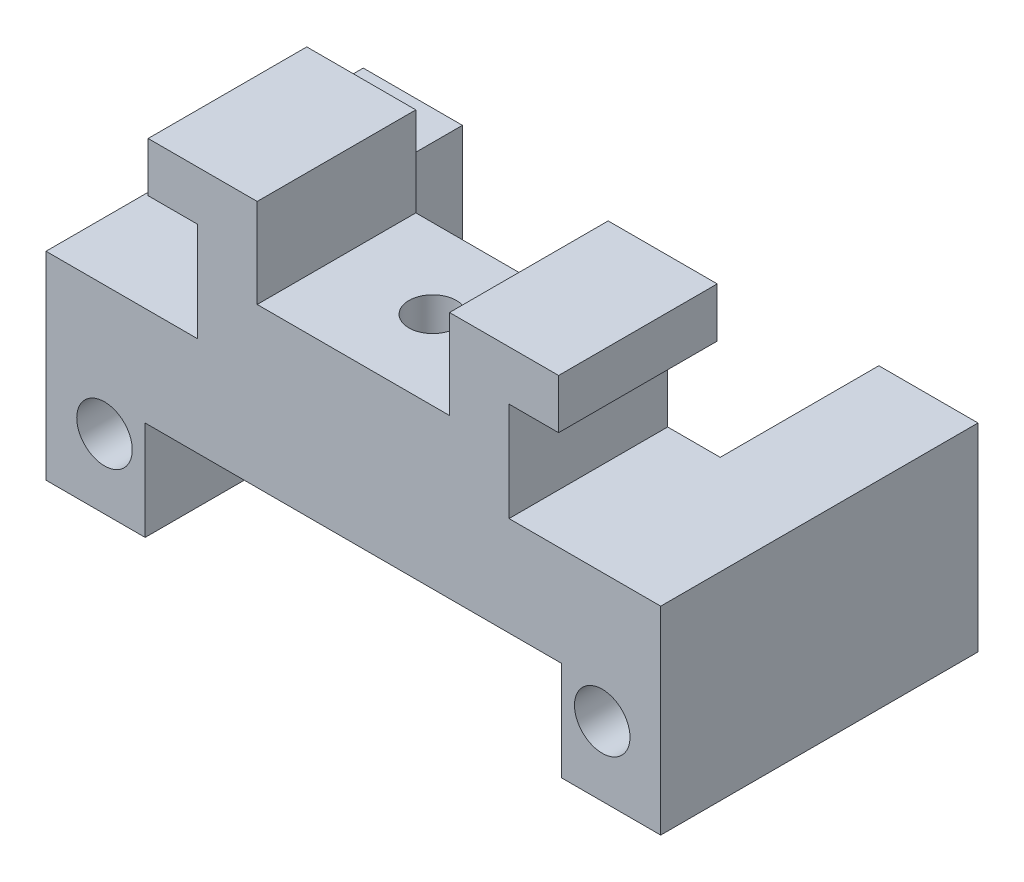
ISO-10303-21;
HEADER;
FILE_DESCRIPTION(('STEP AP214'),'2;1');
FILE_NAME('part.step','',(''),(''),'','','');
FILE_SCHEMA(('AUTOMOTIVE_DESIGN { 1 0 10303 214 1 1 1 1 }'));
ENDSEC;
DATA;
#1=APPLICATION_CONTEXT('core data for automotive mechanical design processes');
#2=APPLICATION_PROTOCOL_DEFINITION('international standard','automotive_design',2000,#1);
#3=PRODUCT_CONTEXT('',#1,'mechanical');
#4=PRODUCT('Part','Part','',(#3));
#5=PRODUCT_RELATED_PRODUCT_CATEGORY('part','',(#4));
#6=PRODUCT_DEFINITION_FORMATION('','',#4);
#7=PRODUCT_DEFINITION_CONTEXT('part definition',#1,'design');
#8=PRODUCT_DEFINITION('design','',#6,#7);
#9=PRODUCT_DEFINITION_SHAPE('','',#8);
#10=(LENGTH_UNIT() NAMED_UNIT(*) SI_UNIT(.MILLI.,.METRE.));
#11=(NAMED_UNIT(*) PLANE_ANGLE_UNIT() SI_UNIT($,.RADIAN.));
#12=(NAMED_UNIT(*) SI_UNIT($,.STERADIAN.) SOLID_ANGLE_UNIT());
#13=UNCERTAINTY_MEASURE_WITH_UNIT(LENGTH_MEASURE(1.E-05),#10,'distance_accuracy_value','');
#14=(GEOMETRIC_REPRESENTATION_CONTEXT(3) GLOBAL_UNCERTAINTY_ASSIGNED_CONTEXT((#13)) GLOBAL_UNIT_ASSIGNED_CONTEXT((#10,
#11,#12)) REPRESENTATION_CONTEXT('',''));
#15=CARTESIAN_POINT('',(0.,0.,0.));
#16=DIRECTION('',(0.,0.,1.));
#17=DIRECTION('',(1.,0.,0.));
#18=AXIS2_PLACEMENT_3D('',#15,#16,#17);
#19=CARTESIAN_POINT('',(0.,0.,0.));
#20=DIRECTION('',(0.,0.,-1.));
#21=DIRECTION('',(-1.,0.,0.));
#22=AXIS2_PLACEMENT_3D('',#19,#20,#21);
#23=PLANE('',#22);
#24=DIRECTION('',(-1.,0.,0.));
#25=VECTOR('',#24,1.);
#26=CARTESIAN_POINT('',(15.5,10.,0.));
#27=LINE('',#26,#25);
#28=CARTESIAN_POINT('',(-10.5,10.,0.));
#29=VERTEX_POINT('',#28);
#30=CARTESIAN_POINT('',(-15.5,10.,0.));
#31=VERTEX_POINT('',#30);
#32=EDGE_CURVE('E322',#29,#31,#27,.T.);
#33=ORIENTED_EDGE('',*,*,#32,.F.);
#34=DIRECTION('',(0.,1.,0.));
#35=VECTOR('',#34,1.);
#36=CARTESIAN_POINT('',(-10.5,0.,0.));
#37=LINE('',#36,#35);
#38=CARTESIAN_POINT('',(-10.5,0.,0.));
#39=VERTEX_POINT('',#38);
#40=EDGE_CURVE('E412',#39,#29,#37,.T.);
#41=ORIENTED_EDGE('',*,*,#40,.F.);
#42=DIRECTION('',(1.,0.,0.));
#43=VECTOR('',#42,1.);
#44=CARTESIAN_POINT('',(-10.5,0.,0.));
#45=LINE('',#44,#43);
#46=CARTESIAN_POINT('',(-15.5,0.,0.));
#47=VERTEX_POINT('',#46);
#48=EDGE_CURVE('E414',#47,#39,#45,.T.);
#49=ORIENTED_EDGE('',*,*,#48,.F.);
#50=DIRECTION('',(0.,-1.,0.));
#51=VECTOR('',#50,1.);
#52=CARTESIAN_POINT('',(-15.5,0.,0.));
#53=LINE('',#52,#51);
#54=EDGE_CURVE('E332',#31,#47,#53,.T.);
#55=ORIENTED_EDGE('',*,*,#54,.F.);
#56=EDGE_LOOP('',(#33,#41,#49,#55));
#57=FACE_BOUND('',#56,.T.);
#58=CARTESIAN_POINT('',(-12.55,3.5,0.));
#59=DIRECTION('',(0.,0.,1.));
#60=DIRECTION('',(-1.,0.,0.));
#61=AXIS2_PLACEMENT_3D('',#58,#59,#60);
#62=CIRCLE('',#61,1.4);
#63=CARTESIAN_POINT('',(-13.95,3.5,0.));
#64=VERTEX_POINT('',#63);
#65=EDGE_CURVE('E449',#64,#64,#62,.T.);
#66=ORIENTED_EDGE('',*,*,#65,.T.);
#67=EDGE_LOOP('',(#66));
#68=FACE_BOUND('',#67,.T.);
#69=ADVANCED_FACE('F32',(#57,#68),#23,.T.);
#70=CARTESIAN_POINT('',(15.5,10.,16.));
#71=DIRECTION('',(0.,-1.,0.));
#72=DIRECTION('',(0.,0.,-1.));
#73=AXIS2_PLACEMENT_3D('',#70,#71,#72);
#74=PLANE('',#73);
#75=DIRECTION('',(-1.,0.,0.));
#76=VECTOR('',#75,1.);
#77=CARTESIAN_POINT('',(15.5,10.,8.));
#78=LINE('',#77,#76);
#79=CARTESIAN_POINT('',(-7.85,10.,8.));
#80=VERTEX_POINT('',#79);
#81=CARTESIAN_POINT('',(-10.5,10.,8.));
#82=VERTEX_POINT('',#81);
#83=EDGE_CURVE('E302',#80,#82,#78,.T.);
#84=ORIENTED_EDGE('',*,*,#83,.T.);
#85=DIRECTION('',(0.,0.,-1.));
#86=VECTOR('',#85,1.);
#87=CARTESIAN_POINT('',(-10.5,10.,16.));
#88=LINE('',#87,#86);
#89=EDGE_CURVE('E308',#82,#29,#88,.T.);
#90=ORIENTED_EDGE('',*,*,#89,.T.);
#91=ORIENTED_EDGE('',*,*,#32,.T.);
#92=DIRECTION('',(0.,0.,-1.));
#93=VECTOR('',#92,1.);
#94=CARTESIAN_POINT('',(-15.5,10.,16.));
#95=LINE('',#94,#93);
#96=CARTESIAN_POINT('',(-15.5,10.,16.));
#97=VERTEX_POINT('',#96);
#98=EDGE_CURVE('E380',#97,#31,#95,.T.);
#99=ORIENTED_EDGE('',*,*,#98,.F.);
#100=DIRECTION('',(-1.,0.,0.));
#101=VECTOR('',#100,1.);
#102=CARTESIAN_POINT('',(15.5,10.,16.));
#103=LINE('',#102,#101);
#104=CARTESIAN_POINT('',(-7.85,10.,16.));
#105=VERTEX_POINT('',#104);
#106=EDGE_CURVE('E345',#105,#97,#103,.T.);
#107=ORIENTED_EDGE('',*,*,#106,.F.);
#108=DIRECTION('',(0.,0.,1.));
#109=VECTOR('',#108,1.);
#110=CARTESIAN_POINT('',(-7.85,10.,16.));
#111=LINE('',#110,#109);
#112=EDGE_CURVE('E311',#80,#105,#111,.T.);
#113=ORIENTED_EDGE('',*,*,#112,.F.);
#114=EDGE_LOOP('',(#84,#90,#91,#99,#107,#113));
#115=FACE_BOUND('',#114,.T.);
#116=ADVANCED_FACE('F434',(#115),#74,.F.);
#117=DIRECTION('',(0.,0.,1.));
#118=VECTOR('',#117,1.);
#119=CARTESIAN_POINT('',(10.5,10.,16.));
#120=LINE('',#119,#118);
#121=CARTESIAN_POINT('',(10.5,10.,0.));
#122=VERTEX_POINT('',#121);
#123=CARTESIAN_POINT('',(10.5,10.,8.));
#124=VERTEX_POINT('',#123);
#125=EDGE_CURVE('E305',#122,#124,#120,.T.);
#126=ORIENTED_EDGE('',*,*,#125,.T.);
#127=DIRECTION('',(-1.,0.,0.));
#128=VECTOR('',#127,1.);
#129=CARTESIAN_POINT('',(15.5,10.,8.));
#130=LINE('',#129,#128);
#131=CARTESIAN_POINT('',(7.85,10.,8.));
#132=VERTEX_POINT('',#131);
#133=EDGE_CURVE('E300',#124,#132,#130,.T.);
#134=ORIENTED_EDGE('',*,*,#133,.T.);
#135=DIRECTION('',(0.,0.,-1.));
#136=VECTOR('',#135,1.);
#137=CARTESIAN_POINT('',(7.85,10.,16.));
#138=LINE('',#137,#136);
#139=CARTESIAN_POINT('',(7.85,10.,16.));
#140=VERTEX_POINT('',#139);
#141=EDGE_CURVE('E188',#140,#132,#138,.T.);
#142=ORIENTED_EDGE('',*,*,#141,.F.);
#143=CARTESIAN_POINT('',(15.5,10.,16.));
#144=VERTEX_POINT('',#143);
#145=EDGE_CURVE('E340',#144,#140,#103,.T.);
#146=ORIENTED_EDGE('',*,*,#145,.F.);
#147=DIRECTION('',(0.,0.,-1.));
#148=VECTOR('',#147,1.);
#149=CARTESIAN_POINT('',(15.5,10.,16.));
#150=LINE('',#149,#148);
#151=CARTESIAN_POINT('',(15.5,10.,0.));
#152=VERTEX_POINT('',#151);
#153=EDGE_CURVE('E373',#144,#152,#150,.T.);
#154=ORIENTED_EDGE('',*,*,#153,.T.);
#155=EDGE_CURVE('E324',#152,#122,#27,.T.);
#156=ORIENTED_EDGE('',*,*,#155,.T.);
#157=EDGE_LOOP('',(#126,#134,#142,#146,#154,#156));
#158=FACE_BOUND('',#157,.T.);
#159=ADVANCED_FACE('F379',(#158),#74,.F.);
#160=CARTESIAN_POINT('',(0.,0.,16.));
#161=DIRECTION('',(0.,0.,-1.));
#162=DIRECTION('',(-1.,0.,0.));
#163=AXIS2_PLACEMENT_3D('',#160,#161,#162);
#164=PLANE('',#163);
#165=CARTESIAN_POINT('',(12.55,3.5,16.));
#166=DIRECTION('',(0.,0.,1.));
#167=DIRECTION('',(1.,0.,0.));
#168=AXIS2_PLACEMENT_3D('',#165,#166,#167);
#169=CIRCLE('',#168,1.4);
#170=CARTESIAN_POINT('',(13.95,3.5,16.));
#171=VERTEX_POINT('',#170);
#172=EDGE_CURVE('E361',#171,#171,#169,.T.);
#173=ORIENTED_EDGE('',*,*,#172,.F.);
#174=EDGE_LOOP('',(#173));
#175=FACE_BOUND('',#174,.T.);
#176=DIRECTION('',(0.,-1.,0.));
#177=VECTOR('',#176,1.);
#178=CARTESIAN_POINT('',(7.85,25.,16.));
#179=LINE('',#178,#177);
#180=CARTESIAN_POINT('',(7.85,15.,16.));
#181=VERTEX_POINT('',#180);
#182=EDGE_CURVE('E450',#181,#140,#179,.T.);
#183=ORIENTED_EDGE('',*,*,#182,.F.);
#184=DIRECTION('',(1.,0.,0.));
#185=VECTOR('',#184,1.);
#186=CARTESIAN_POINT('',(7.85,15.,16.));
#187=LINE('',#186,#185);
#188=CARTESIAN_POINT('',(10.35,15.,16.));
#189=VERTEX_POINT('',#188);
#190=EDGE_CURVE('E200',#181,#189,#187,.T.);
#191=ORIENTED_EDGE('',*,*,#190,.T.);
#192=DIRECTION('',(0.,1.,0.));
#193=VECTOR('',#192,1.);
#194=CARTESIAN_POINT('',(10.35,15.,16.));
#195=LINE('',#194,#193);
#196=CARTESIAN_POINT('',(10.35,17.5,16.));
#197=VERTEX_POINT('',#196);
#198=EDGE_CURVE('E222',#189,#197,#195,.T.);
#199=ORIENTED_EDGE('',*,*,#198,.T.);
#200=DIRECTION('',(-1.,0.,0.));
#201=VECTOR('',#200,1.);
#202=CARTESIAN_POINT('',(10.35,17.5,16.));
#203=LINE('',#202,#201);
#204=CARTESIAN_POINT('',(4.85000000000001,17.5,16.));
#205=VERTEX_POINT('',#204);
#206=EDGE_CURVE('E213',#197,#205,#203,.T.);
#207=ORIENTED_EDGE('',*,*,#206,.T.);
#208=DIRECTION('',(0.,-1.,0.));
#209=VECTOR('',#208,1.);
#210=CARTESIAN_POINT('',(4.85000000000001,17.5,16.));
#211=LINE('',#210,#209);
#212=CARTESIAN_POINT('',(4.85,13.,16.));
#213=VERTEX_POINT('',#212);
#214=EDGE_CURVE('E218',#205,#213,#211,.T.);
#215=ORIENTED_EDGE('',*,*,#214,.T.);
#216=DIRECTION('',(1.,0.,0.));
#217=VECTOR('',#216,1.);
#218=CARTESIAN_POINT('',(-10.3639747074169,13.,16.));
#219=LINE('',#218,#217);
#220=CARTESIAN_POINT('',(-4.85,13.,16.));
#221=VERTEX_POINT('',#220);
#222=EDGE_CURVE('E49',#221,#213,#219,.T.);
#223=ORIENTED_EDGE('',*,*,#222,.F.);
#224=DIRECTION('',(0.,1.,0.));
#225=VECTOR('',#224,1.);
#226=CARTESIAN_POINT('',(-4.85,17.5,16.));
#227=LINE('',#226,#225);
#228=CARTESIAN_POINT('',(-4.85,17.5,16.));
#229=VERTEX_POINT('',#228);
#230=EDGE_CURVE('E229',#221,#229,#227,.T.);
#231=ORIENTED_EDGE('',*,*,#230,.T.);
#232=DIRECTION('',(-1.,0.,0.));
#233=VECTOR('',#232,1.);
#234=CARTESIAN_POINT('',(-10.35,17.5,16.));
#235=LINE('',#234,#233);
#236=CARTESIAN_POINT('',(-10.35,17.5,16.));
#237=VERTEX_POINT('',#236);
#238=EDGE_CURVE('E245',#229,#237,#235,.T.);
#239=ORIENTED_EDGE('',*,*,#238,.T.);
#240=DIRECTION('',(0.,-1.,0.));
#241=VECTOR('',#240,1.);
#242=CARTESIAN_POINT('',(-10.35,15.,16.));
#243=LINE('',#242,#241);
#244=CARTESIAN_POINT('',(-10.35,15.,16.));
#245=VERTEX_POINT('',#244);
#246=EDGE_CURVE('E248',#237,#245,#243,.T.);
#247=ORIENTED_EDGE('',*,*,#246,.T.);
#248=DIRECTION('',(1.,0.,0.));
#249=VECTOR('',#248,1.);
#250=CARTESIAN_POINT('',(-7.85,15.,16.));
#251=LINE('',#250,#249);
#252=CARTESIAN_POINT('',(-7.85,15.,16.));
#253=VERTEX_POINT('',#252);
#254=EDGE_CURVE('E251',#245,#253,#251,.T.);
#255=ORIENTED_EDGE('',*,*,#254,.T.);
#256=DIRECTION('',(0.,-1.,0.));
#257=VECTOR('',#256,1.);
#258=CARTESIAN_POINT('',(-7.85,25.,16.));
#259=LINE('',#258,#257);
#260=EDGE_CURVE('E446',#253,#105,#259,.T.);
#261=ORIENTED_EDGE('',*,*,#260,.T.);
#262=ORIENTED_EDGE('',*,*,#106,.T.);
#263=DIRECTION('',(0.,-1.,0.));
#264=VECTOR('',#263,1.);
#265=CARTESIAN_POINT('',(-15.5,0.,16.));
#266=LINE('',#265,#264);
#267=CARTESIAN_POINT('',(-15.5,0.,16.));
#268=VERTEX_POINT('',#267);
#269=EDGE_CURVE('E344',#97,#268,#266,.T.);
#270=ORIENTED_EDGE('',*,*,#269,.T.);
#271=DIRECTION('',(1.,0.,0.));
#272=VECTOR('',#271,1.);
#273=CARTESIAN_POINT('',(-10.5,0.,16.));
#274=LINE('',#273,#272);
#275=CARTESIAN_POINT('',(-10.5,0.,16.));
#276=VERTEX_POINT('',#275);
#277=EDGE_CURVE('E354',#268,#276,#274,.T.);
#278=ORIENTED_EDGE('',*,*,#277,.T.);
#279=DIRECTION('',(0.,1.,0.));
#280=VECTOR('',#279,1.);
#281=CARTESIAN_POINT('',(-10.5,0.,16.));
#282=LINE('',#281,#280);
#283=CARTESIAN_POINT('',(-10.5,5.,16.));
#284=VERTEX_POINT('',#283);
#285=EDGE_CURVE('E356',#276,#284,#282,.T.);
#286=ORIENTED_EDGE('',*,*,#285,.T.);
#287=DIRECTION('',(1.,0.,0.));
#288=VECTOR('',#287,1.);
#289=CARTESIAN_POINT('',(10.5,5.,16.));
#290=LINE('',#289,#288);
#291=CARTESIAN_POINT('',(10.5,5.,16.));
#292=VERTEX_POINT('',#291);
#293=EDGE_CURVE('E413',#284,#292,#290,.T.);
#294=ORIENTED_EDGE('',*,*,#293,.T.);
#295=DIRECTION('',(0.,-1.,0.));
#296=VECTOR('',#295,1.);
#297=CARTESIAN_POINT('',(10.5,0.,16.));
#298=LINE('',#297,#296);
#299=CARTESIAN_POINT('',(10.5,0.,16.));
#300=VERTEX_POINT('',#299);
#301=EDGE_CURVE('E397',#292,#300,#298,.T.);
#302=ORIENTED_EDGE('',*,*,#301,.T.);
#303=DIRECTION('',(1.,0.,0.));
#304=VECTOR('',#303,1.);
#305=CARTESIAN_POINT('',(10.5,0.,16.));
#306=LINE('',#305,#304);
#307=CARTESIAN_POINT('',(15.5,0.,16.));
#308=VERTEX_POINT('',#307);
#309=EDGE_CURVE('E441',#300,#308,#306,.T.);
#310=ORIENTED_EDGE('',*,*,#309,.T.);
#311=DIRECTION('',(0.,1.,0.));
#312=VECTOR('',#311,1.);
#313=CARTESIAN_POINT('',(15.5,0.,16.));
#314=LINE('',#313,#312);
#315=EDGE_CURVE('E350',#308,#144,#314,.T.);
#316=ORIENTED_EDGE('',*,*,#315,.T.);
#317=ORIENTED_EDGE('',*,*,#145,.T.);
#318=EDGE_LOOP('',(#183,#191,#199,#207,#215,#223,#231,#239,#247,#255,#261,#262,#270,#278,#286,
#294,#302,#310,#316,#317));
#319=FACE_BOUND('',#318,.T.);
#320=CARTESIAN_POINT('',(-12.55,3.5,16.));
#321=DIRECTION('',(0.,0.,1.));
#322=DIRECTION('',(-1.,0.,0.));
#323=AXIS2_PLACEMENT_3D('',#320,#321,#322);
#324=CIRCLE('',#323,1.4);
#325=CARTESIAN_POINT('',(-13.95,3.5,16.));
#326=VERTEX_POINT('',#325);
#327=EDGE_CURVE('E731',#326,#326,#324,.T.);
#328=ORIENTED_EDGE('',*,*,#327,.F.);
#329=EDGE_LOOP('',(#328));
#330=FACE_BOUND('',#329,.T.);
#331=ADVANCED_FACE('F282',(#175,#319,#330),#164,.F.);
#332=DIRECTION('',(0.,-1.,0.));
#333=VECTOR('',#332,1.);
#334=CARTESIAN_POINT('',(10.5,0.,0.));
#335=LINE('',#334,#333);
#336=CARTESIAN_POINT('',(10.5,0.,0.));
#337=VERTEX_POINT('',#336);
#338=EDGE_CURVE('E359',#122,#337,#335,.T.);
#339=ORIENTED_EDGE('',*,*,#338,.F.);
#340=ORIENTED_EDGE('',*,*,#155,.F.);
#341=DIRECTION('',(0.,1.,0.));
#342=VECTOR('',#341,1.);
#343=CARTESIAN_POINT('',(15.5,0.,0.));
#344=LINE('',#343,#342);
#345=CARTESIAN_POINT('',(15.5,0.,0.));
#346=VERTEX_POINT('',#345);
#347=EDGE_CURVE('E325',#346,#152,#344,.T.);
#348=ORIENTED_EDGE('',*,*,#347,.F.);
#349=DIRECTION('',(1.,0.,0.));
#350=VECTOR('',#349,1.);
#351=CARTESIAN_POINT('',(10.5,0.,0.));
#352=LINE('',#351,#350);
#353=EDGE_CURVE('E360',#337,#346,#352,.T.);
#354=ORIENTED_EDGE('',*,*,#353,.F.);
#355=EDGE_LOOP('',(#339,#340,#348,#354));
#356=FACE_BOUND('',#355,.T.);
#357=CARTESIAN_POINT('',(12.55,3.5,0.));
#358=DIRECTION('',(0.,0.,1.));
#359=DIRECTION('',(1.,0.,0.));
#360=AXIS2_PLACEMENT_3D('',#357,#358,#359);
#361=CIRCLE('',#360,1.4);
#362=CARTESIAN_POINT('',(13.95,3.5,0.));
#363=VERTEX_POINT('',#362);
#364=EDGE_CURVE('E444',#363,#363,#361,.T.);
#365=ORIENTED_EDGE('',*,*,#364,.T.);
#366=EDGE_LOOP('',(#365));
#367=FACE_BOUND('',#366,.T.);
#368=ADVANCED_FACE('F382',(#356,#367),#23,.T.);
#369=CARTESIAN_POINT('',(10.5,5.,16.));
#370=DIRECTION('',(0.,1.,0.));
#371=DIRECTION('',(0.,0.,1.));
#372=AXIS2_PLACEMENT_3D('',#369,#370,#371);
#373=PLANE('',#372);
#374=CARTESIAN_POINT('',(0.,5.,12.));
#375=DIRECTION('',(0.,-1.,0.));
#376=DIRECTION('',(0.,0.,-1.));
#377=AXIS2_PLACEMENT_3D('',#374,#375,#376);
#378=CIRCLE('',#377,1.2);
#379=CARTESIAN_POINT('',(0.,5.,10.8));
#380=VERTEX_POINT('',#379);
#381=EDGE_CURVE('E257',#380,#380,#378,.T.);
#382=ORIENTED_EDGE('',*,*,#381,.F.);
#383=EDGE_LOOP('',(#382));
#384=FACE_BOUND('',#383,.T.);
#385=DIRECTION('',(0.,0.,-1.));
#386=VECTOR('',#385,1.);
#387=CARTESIAN_POINT('',(-10.5,5.,16.));
#388=LINE('',#387,#386);
#389=CARTESIAN_POINT('',(-10.5,5.,8.));
#390=VERTEX_POINT('',#389);
#391=EDGE_CURVE('E358',#284,#390,#388,.T.);
#392=ORIENTED_EDGE('',*,*,#391,.T.);
#393=DIRECTION('',(-1.,0.,0.));
#394=VECTOR('',#393,1.);
#395=CARTESIAN_POINT('',(-10.5,5.,8.));
#396=LINE('',#395,#394);
#397=CARTESIAN_POINT('',(10.5,5.,8.));
#398=VERTEX_POINT('',#397);
#399=EDGE_CURVE('E285',#398,#390,#396,.T.);
#400=ORIENTED_EDGE('',*,*,#399,.F.);
#401=DIRECTION('',(0.,0.,-1.));
#402=VECTOR('',#401,1.);
#403=CARTESIAN_POINT('',(10.5,5.,16.));
#404=LINE('',#403,#402);
#405=EDGE_CURVE('E41',#292,#398,#404,.T.);
#406=ORIENTED_EDGE('',*,*,#405,.F.);
#407=ORIENTED_EDGE('',*,*,#293,.F.);
#408=EDGE_LOOP('',(#392,#400,#406,#407));
#409=FACE_BOUND('',#408,.T.);
#410=ADVANCED_FACE('F34',(#384,#409),#373,.F.);
#411=CARTESIAN_POINT('',(10.5,0.,16.));
#412=DIRECTION('',(1.,0.,0.));
#413=DIRECTION('',(0.,0.,-1.));
#414=AXIS2_PLACEMENT_3D('',#411,#412,#413);
#415=PLANE('',#414);
#416=ORIENTED_EDGE('',*,*,#338,.T.);
#417=DIRECTION('',(0.,0.,-1.));
#418=VECTOR('',#417,1.);
#419=CARTESIAN_POINT('',(10.5,0.,16.));
#420=LINE('',#419,#418);
#421=EDGE_CURVE('E399',#300,#337,#420,.T.);
#422=ORIENTED_EDGE('',*,*,#421,.F.);
#423=ORIENTED_EDGE('',*,*,#301,.F.);
#424=ORIENTED_EDGE('',*,*,#405,.T.);
#425=DIRECTION('',(0.,-1.,0.));
#426=VECTOR('',#425,1.);
#427=CARTESIAN_POINT('',(10.5,26.,8.));
#428=LINE('',#427,#426);
#429=EDGE_CURVE('E289',#124,#398,#428,.T.);
#430=ORIENTED_EDGE('',*,*,#429,.F.);
#431=ORIENTED_EDGE('',*,*,#125,.F.);
#432=EDGE_LOOP('',(#416,#422,#423,#424,#430,#431));
#433=FACE_BOUND('',#432,.T.);
#434=ADVANCED_FACE('F388',(#433),#415,.F.);
#435=CARTESIAN_POINT('',(10.5,0.,16.));
#436=DIRECTION('',(0.,1.,0.));
#437=DIRECTION('',(-1.,0.,0.));
#438=AXIS2_PLACEMENT_3D('',#435,#436,#437);
#439=PLANE('',#438);
#440=ORIENTED_EDGE('',*,*,#353,.T.);
#441=DIRECTION('',(0.,0.,-1.));
#442=VECTOR('',#441,1.);
#443=CARTESIAN_POINT('',(15.5,0.,16.));
#444=LINE('',#443,#442);
#445=EDGE_CURVE('E375',#308,#346,#444,.T.);
#446=ORIENTED_EDGE('',*,*,#445,.F.);
#447=ORIENTED_EDGE('',*,*,#309,.F.);
#448=ORIENTED_EDGE('',*,*,#421,.T.);
#449=EDGE_LOOP('',(#440,#446,#447,#448));
#450=FACE_BOUND('',#449,.T.);
#451=ADVANCED_FACE('F644',(#450),#439,.F.);
#452=CARTESIAN_POINT('',(15.5,0.,16.));
#453=DIRECTION('',(-1.,0.,0.));
#454=DIRECTION('',(0.,0.,1.));
#455=AXIS2_PLACEMENT_3D('',#452,#453,#454);
#456=PLANE('',#455);
#457=ORIENTED_EDGE('',*,*,#347,.T.);
#458=ORIENTED_EDGE('',*,*,#153,.F.);
#459=ORIENTED_EDGE('',*,*,#315,.F.);
#460=ORIENTED_EDGE('',*,*,#445,.T.);
#461=EDGE_LOOP('',(#457,#458,#459,#460));
#462=FACE_BOUND('',#461,.T.);
#463=ADVANCED_FACE('F371',(#462),#456,.F.);
#464=CARTESIAN_POINT('',(-15.5,0.,16.));
#465=DIRECTION('',(1.,0.,0.));
#466=DIRECTION('',(0.,0.,-1.));
#467=AXIS2_PLACEMENT_3D('',#464,#465,#466);
#468=PLANE('',#467);
#469=ORIENTED_EDGE('',*,*,#54,.T.);
#470=DIRECTION('',(0.,0.,-1.));
#471=VECTOR('',#470,1.);
#472=CARTESIAN_POINT('',(-15.5,0.,16.));
#473=LINE('',#472,#471);
#474=EDGE_CURVE('E405',#268,#47,#473,.T.);
#475=ORIENTED_EDGE('',*,*,#474,.F.);
#476=ORIENTED_EDGE('',*,*,#269,.F.);
#477=ORIENTED_EDGE('',*,*,#98,.T.);
#478=EDGE_LOOP('',(#469,#475,#476,#477));
#479=FACE_BOUND('',#478,.T.);
#480=ADVANCED_FACE('F421',(#479),#468,.F.);
#481=CARTESIAN_POINT('',(-10.5,0.,16.));
#482=DIRECTION('',(0.,1.,0.));
#483=DIRECTION('',(-1.,0.,0.));
#484=AXIS2_PLACEMENT_3D('',#481,#482,#483);
#485=PLANE('',#484);
#486=ORIENTED_EDGE('',*,*,#48,.T.);
#487=DIRECTION('',(0.,0.,-1.));
#488=VECTOR('',#487,1.);
#489=CARTESIAN_POINT('',(-10.5,0.,16.));
#490=LINE('',#489,#488);
#491=EDGE_CURVE('E408',#276,#39,#490,.T.);
#492=ORIENTED_EDGE('',*,*,#491,.F.);
#493=ORIENTED_EDGE('',*,*,#277,.F.);
#494=ORIENTED_EDGE('',*,*,#474,.T.);
#495=EDGE_LOOP('',(#486,#492,#493,#494));
#496=FACE_BOUND('',#495,.T.);
#497=ADVANCED_FACE('F427',(#496),#485,.F.);
#498=CARTESIAN_POINT('',(-10.5,0.,16.));
#499=DIRECTION('',(-1.,0.,0.));
#500=DIRECTION('',(0.,-1.,0.));
#501=AXIS2_PLACEMENT_3D('',#498,#499,#500);
#502=PLANE('',#501);
#503=ORIENTED_EDGE('',*,*,#40,.T.);
#504=ORIENTED_EDGE('',*,*,#89,.F.);
#505=DIRECTION('',(0.,-1.,0.));
#506=VECTOR('',#505,1.);
#507=CARTESIAN_POINT('',(-10.5,26.,8.));
#508=LINE('',#507,#506);
#509=EDGE_CURVE('E193',#82,#390,#508,.T.);
#510=ORIENTED_EDGE('',*,*,#509,.T.);
#511=ORIENTED_EDGE('',*,*,#391,.F.);
#512=ORIENTED_EDGE('',*,*,#285,.F.);
#513=ORIENTED_EDGE('',*,*,#491,.T.);
#514=EDGE_LOOP('',(#503,#504,#510,#511,#512,#513));
#515=FACE_BOUND('',#514,.T.);
#516=ADVANCED_FACE('F431',(#515),#502,.F.);
#517=CARTESIAN_POINT('',(12.55,3.5,16.));
#518=DIRECTION('',(0.,0.,-1.));
#519=DIRECTION('',(-1.,0.,0.));
#520=AXIS2_PLACEMENT_3D('',#517,#518,#519);
#521=CYLINDRICAL_SURFACE('',#520,1.4);
#522=ORIENTED_EDGE('',*,*,#172,.T.);
#523=EDGE_LOOP('',(#522));
#524=FACE_BOUND('',#523,.T.);
#525=ORIENTED_EDGE('',*,*,#364,.F.);
#526=EDGE_LOOP('',(#525));
#527=FACE_BOUND('',#526,.T.);
#528=ADVANCED_FACE('F488',(#524,#527),#521,.F.);
#529=CARTESIAN_POINT('',(-12.55,3.5,16.));
#530=DIRECTION('',(0.,0.,-1.));
#531=DIRECTION('',(-1.,0.,0.));
#532=AXIS2_PLACEMENT_3D('',#529,#530,#531);
#533=CYLINDRICAL_SURFACE('',#532,1.4);
#534=ORIENTED_EDGE('',*,*,#327,.T.);
#535=EDGE_LOOP('',(#534));
#536=FACE_BOUND('',#535,.T.);
#537=ORIENTED_EDGE('',*,*,#65,.F.);
#538=EDGE_LOOP('',(#537));
#539=FACE_BOUND('',#538,.T.);
#540=ADVANCED_FACE('F491',(#536,#539),#533,.F.);
#541=CARTESIAN_POINT('',(-7.85,25.,16.));
#542=DIRECTION('',(1.,0.,0.));
#543=DIRECTION('',(0.,0.,-1.));
#544=AXIS2_PLACEMENT_3D('',#541,#542,#543);
#545=PLANE('',#544);
#546=ORIENTED_EDGE('',*,*,#260,.F.);
#547=DIRECTION('',(0.,0.,1.));
#548=VECTOR('',#547,1.);
#549=CARTESIAN_POINT('',(-7.85,15.,8.));
#550=LINE('',#549,#548);
#551=CARTESIAN_POINT('',(-7.85,15.,8.));
#552=VERTEX_POINT('',#551);
#553=EDGE_CURVE('E254',#552,#253,#550,.T.);
#554=ORIENTED_EDGE('',*,*,#553,.F.);
#555=DIRECTION('',(0.,-1.,0.));
#556=VECTOR('',#555,1.);
#557=CARTESIAN_POINT('',(-7.85,25.,8.));
#558=LINE('',#557,#556);
#559=EDGE_CURVE('E192',#552,#80,#558,.T.);
#560=ORIENTED_EDGE('',*,*,#559,.T.);
#561=ORIENTED_EDGE('',*,*,#112,.T.);
#562=EDGE_LOOP('',(#546,#554,#560,#561));
#563=FACE_BOUND('',#562,.T.);
#564=ADVANCED_FACE('F451',(#563),#545,.F.);
#565=CARTESIAN_POINT('',(7.85,25.,16.));
#566=DIRECTION('',(-1.,0.,0.));
#567=DIRECTION('',(0.,0.,1.));
#568=AXIS2_PLACEMENT_3D('',#565,#566,#567);
#569=PLANE('',#568);
#570=DIRECTION('',(0.,1.,0.));
#571=VECTOR('',#570,1.);
#572=CARTESIAN_POINT('',(7.85,25.,8.));
#573=LINE('',#572,#571);
#574=CARTESIAN_POINT('',(7.85,15.,8.));
#575=VERTEX_POINT('',#574);
#576=EDGE_CURVE('E182',#132,#575,#573,.T.);
#577=ORIENTED_EDGE('',*,*,#576,.T.);
#578=DIRECTION('',(0.,0.,1.));
#579=VECTOR('',#578,1.);
#580=CARTESIAN_POINT('',(7.85,15.,8.));
#581=LINE('',#580,#579);
#582=EDGE_CURVE('E185',#575,#181,#581,.T.);
#583=ORIENTED_EDGE('',*,*,#582,.T.);
#584=ORIENTED_EDGE('',*,*,#182,.T.);
#585=ORIENTED_EDGE('',*,*,#141,.T.);
#586=EDGE_LOOP('',(#577,#583,#584,#585));
#587=FACE_BOUND('',#586,.T.);
#588=ADVANCED_FACE('F184',(#587),#569,.F.);
#589=CARTESIAN_POINT('',(-10.5,26.,8.));
#590=DIRECTION('',(0.,0.,1.));
#591=DIRECTION('',(1.,0.,0.));
#592=AXIS2_PLACEMENT_3D('',#589,#590,#591);
#593=PLANE('',#592);
#594=ORIENTED_EDGE('',*,*,#559,.F.);
#595=DIRECTION('',(1.,0.,0.));
#596=VECTOR('',#595,1.);
#597=CARTESIAN_POINT('',(-7.85,15.,8.));
#598=LINE('',#597,#596);
#599=CARTESIAN_POINT('',(-10.35,15.,8.));
#600=VERTEX_POINT('',#599);
#601=EDGE_CURVE('E241',#600,#552,#598,.T.);
#602=ORIENTED_EDGE('',*,*,#601,.F.);
#603=DIRECTION('',(0.,-1.,0.));
#604=VECTOR('',#603,1.);
#605=CARTESIAN_POINT('',(-10.35,15.,8.));
#606=LINE('',#605,#604);
#607=CARTESIAN_POINT('',(-10.35,17.5,8.));
#608=VERTEX_POINT('',#607);
#609=EDGE_CURVE('E237',#608,#600,#606,.T.);
#610=ORIENTED_EDGE('',*,*,#609,.F.);
#611=DIRECTION('',(-1.,0.,0.));
#612=VECTOR('',#611,1.);
#613=CARTESIAN_POINT('',(-10.35,17.5,8.));
#614=LINE('',#613,#612);
#615=CARTESIAN_POINT('',(-4.85,17.5,8.));
#616=VERTEX_POINT('',#615);
#617=EDGE_CURVE('E234',#616,#608,#614,.T.);
#618=ORIENTED_EDGE('',*,*,#617,.F.);
#619=DIRECTION('',(0.,1.,0.));
#620=VECTOR('',#619,1.);
#621=CARTESIAN_POINT('',(-4.85,17.5,8.));
#622=LINE('',#621,#620);
#623=CARTESIAN_POINT('',(-4.85,13.,8.));
#624=VERTEX_POINT('',#623);
#625=EDGE_CURVE('E238',#624,#616,#622,.T.);
#626=ORIENTED_EDGE('',*,*,#625,.F.);
#627=DIRECTION('',(1.,0.,0.));
#628=VECTOR('',#627,1.);
#629=CARTESIAN_POINT('',(-10.5,13.,8.));
#630=LINE('',#629,#628);
#631=CARTESIAN_POINT('',(4.85,13.,8.));
#632=VERTEX_POINT('',#631);
#633=EDGE_CURVE('E11',#624,#632,#630,.T.);
#634=ORIENTED_EDGE('',*,*,#633,.T.);
#635=DIRECTION('',(0.,-1.,0.));
#636=VECTOR('',#635,1.);
#637=CARTESIAN_POINT('',(4.85000000000001,17.5,8.));
#638=LINE('',#637,#636);
#639=CARTESIAN_POINT('',(4.85000000000001,17.5,8.));
#640=VERTEX_POINT('',#639);
#641=EDGE_CURVE('E208',#640,#632,#638,.T.);
#642=ORIENTED_EDGE('',*,*,#641,.F.);
#643=DIRECTION('',(-1.,0.,0.));
#644=VECTOR('',#643,1.);
#645=CARTESIAN_POINT('',(10.35,17.5,8.));
#646=LINE('',#645,#644);
#647=CARTESIAN_POINT('',(10.35,17.5,8.));
#648=VERTEX_POINT('',#647);
#649=EDGE_CURVE('E210',#648,#640,#646,.T.);
#650=ORIENTED_EDGE('',*,*,#649,.F.);
#651=DIRECTION('',(0.,1.,0.));
#652=VECTOR('',#651,1.);
#653=CARTESIAN_POINT('',(10.35,15.,8.));
#654=LINE('',#653,#652);
#655=CARTESIAN_POINT('',(10.35,15.,8.));
#656=VERTEX_POINT('',#655);
#657=EDGE_CURVE('E207',#656,#648,#654,.T.);
#658=ORIENTED_EDGE('',*,*,#657,.F.);
#659=DIRECTION('',(1.,0.,0.));
#660=VECTOR('',#659,1.);
#661=CARTESIAN_POINT('',(7.85,15.,8.));
#662=LINE('',#661,#660);
#663=EDGE_CURVE('E198',#575,#656,#662,.T.);
#664=ORIENTED_EDGE('',*,*,#663,.F.);
#665=ORIENTED_EDGE('',*,*,#576,.F.);
#666=ORIENTED_EDGE('',*,*,#133,.F.);
#667=ORIENTED_EDGE('',*,*,#429,.T.);
#668=ORIENTED_EDGE('',*,*,#399,.T.);
#669=ORIENTED_EDGE('',*,*,#509,.F.);
#670=ORIENTED_EDGE('',*,*,#83,.F.);
#671=EDGE_LOOP('',(#594,#602,#610,#618,#626,#634,#642,#650,#658,#664,#665,#666,#667,#668,#669,#670));
#672=FACE_BOUND('',#671,.T.);
#673=ADVANCED_FACE('F204',(#672),#593,.F.);
#674=CARTESIAN_POINT('',(-10.3639747074169,13.,6.));
#675=DIRECTION('',(0.,-1.,0.));
#676=DIRECTION('',(0.,0.,-1.));
#677=AXIS2_PLACEMENT_3D('',#674,#675,#676);
#678=PLANE('',#677);
#679=CARTESIAN_POINT('',(0.,13.,12.));
#680=DIRECTION('',(0.,-1.,0.));
#681=DIRECTION('',(0.,0.,-1.));
#682=AXIS2_PLACEMENT_3D('',#679,#680,#681);
#683=CIRCLE('',#682,1.2);
#684=CARTESIAN_POINT('',(0.,13.,10.8));
#685=VERTEX_POINT('',#684);
#686=EDGE_CURVE('E286',#685,#685,#683,.T.);
#687=ORIENTED_EDGE('',*,*,#686,.T.);
#688=EDGE_LOOP('',(#687));
#689=FACE_BOUND('',#688,.T.);
#690=ORIENTED_EDGE('',*,*,#222,.T.);
#691=DIRECTION('',(0.,0.,1.));
#692=VECTOR('',#691,1.);
#693=CARTESIAN_POINT('',(4.85,13.,8.));
#694=LINE('',#693,#692);
#695=EDGE_CURVE('E53',#632,#213,#694,.T.);
#696=ORIENTED_EDGE('',*,*,#695,.F.);
#697=ORIENTED_EDGE('',*,*,#633,.F.);
#698=DIRECTION('',(0.,0.,1.));
#699=VECTOR('',#698,1.);
#700=CARTESIAN_POINT('',(-4.85,13.,8.));
#701=LINE('',#700,#699);
#702=EDGE_CURVE('E244',#624,#221,#701,.T.);
#703=ORIENTED_EDGE('',*,*,#702,.T.);
#704=EDGE_LOOP('',(#690,#696,#697,#703));
#705=FACE_BOUND('',#704,.T.);
#706=ADVANCED_FACE('F279',(#689,#705),#678,.F.);
#707=CARTESIAN_POINT('',(0.,13.000025,12.));
#708=DIRECTION('',(0.,-1.,0.));
#709=DIRECTION('',(0.,0.,-1.));
#710=AXIS2_PLACEMENT_3D('',#707,#708,#709);
#711=CYLINDRICAL_SURFACE('',#710,1.2);
#712=ORIENTED_EDGE('',*,*,#381,.T.);
#713=EDGE_LOOP('',(#712));
#714=FACE_BOUND('',#713,.T.);
#715=ORIENTED_EDGE('',*,*,#686,.F.);
#716=EDGE_LOOP('',(#715));
#717=FACE_BOUND('',#716,.T.);
#718=ADVANCED_FACE('F504',(#714,#717),#711,.F.);
#719=CARTESIAN_POINT('',(-7.85,15.,8.));
#720=DIRECTION('',(0.,-1.,0.));
#721=DIRECTION('',(0.,0.,-1.));
#722=AXIS2_PLACEMENT_3D('',#719,#720,#721);
#723=PLANE('',#722);
#724=ORIENTED_EDGE('',*,*,#254,.F.);
#725=DIRECTION('',(0.,0.,1.));
#726=VECTOR('',#725,1.);
#727=CARTESIAN_POINT('',(-10.35,15.,8.));
#728=LINE('',#727,#726);
#729=EDGE_CURVE('E258',#600,#245,#728,.T.);
#730=ORIENTED_EDGE('',*,*,#729,.F.);
#731=ORIENTED_EDGE('',*,*,#601,.T.);
#732=ORIENTED_EDGE('',*,*,#553,.T.);
#733=EDGE_LOOP('',(#724,#730,#731,#732));
#734=FACE_BOUND('',#733,.T.);
#735=ADVANCED_FACE('F453',(#734),#723,.T.);
#736=CARTESIAN_POINT('',(-10.35,15.,8.));
#737=DIRECTION('',(-1.,0.,0.));
#738=DIRECTION('',(0.,0.,1.));
#739=AXIS2_PLACEMENT_3D('',#736,#737,#738);
#740=PLANE('',#739);
#741=ORIENTED_EDGE('',*,*,#246,.F.);
#742=DIRECTION('',(0.,0.,1.));
#743=VECTOR('',#742,1.);
#744=CARTESIAN_POINT('',(-10.35,17.5,8.));
#745=LINE('',#744,#743);
#746=EDGE_CURVE('E260',#608,#237,#745,.T.);
#747=ORIENTED_EDGE('',*,*,#746,.F.);
#748=ORIENTED_EDGE('',*,*,#609,.T.);
#749=ORIENTED_EDGE('',*,*,#729,.T.);
#750=EDGE_LOOP('',(#741,#747,#748,#749));
#751=FACE_BOUND('',#750,.T.);
#752=ADVANCED_FACE('F456',(#751),#740,.T.);
#753=CARTESIAN_POINT('',(-10.35,17.5,8.));
#754=DIRECTION('',(0.,1.,0.));
#755=DIRECTION('',(0.,0.,1.));
#756=AXIS2_PLACEMENT_3D('',#753,#754,#755);
#757=PLANE('',#756);
#758=ORIENTED_EDGE('',*,*,#238,.F.);
#759=DIRECTION('',(0.,0.,1.));
#760=VECTOR('',#759,1.);
#761=CARTESIAN_POINT('',(-4.85,17.5,8.));
#762=LINE('',#761,#760);
#763=EDGE_CURVE('E262',#616,#229,#762,.T.);
#764=ORIENTED_EDGE('',*,*,#763,.F.);
#765=ORIENTED_EDGE('',*,*,#617,.T.);
#766=ORIENTED_EDGE('',*,*,#746,.T.);
#767=EDGE_LOOP('',(#758,#764,#765,#766));
#768=FACE_BOUND('',#767,.T.);
#769=ADVANCED_FACE('F458',(#768),#757,.T.);
#770=CARTESIAN_POINT('',(-4.85,17.5,8.));
#771=DIRECTION('',(1.,0.,0.));
#772=DIRECTION('',(0.,0.,-1.));
#773=AXIS2_PLACEMENT_3D('',#770,#771,#772);
#774=PLANE('',#773);
#775=ORIENTED_EDGE('',*,*,#230,.F.);
#776=ORIENTED_EDGE('',*,*,#702,.F.);
#777=ORIENTED_EDGE('',*,*,#625,.T.);
#778=ORIENTED_EDGE('',*,*,#763,.T.);
#779=EDGE_LOOP('',(#775,#776,#777,#778));
#780=FACE_BOUND('',#779,.T.);
#781=ADVANCED_FACE('F274',(#780),#774,.T.);
#782=CARTESIAN_POINT('',(4.85000000000001,17.5,8.));
#783=DIRECTION('',(-1.,0.,0.));
#784=DIRECTION('',(0.,-1.,0.));
#785=AXIS2_PLACEMENT_3D('',#782,#783,#784);
#786=PLANE('',#785);
#787=ORIENTED_EDGE('',*,*,#214,.F.);
#788=DIRECTION('',(0.,0.,1.));
#789=VECTOR('',#788,1.);
#790=CARTESIAN_POINT('',(4.85000000000001,17.5,8.));
#791=LINE('',#790,#789);
#792=EDGE_CURVE('E227',#640,#205,#791,.T.);
#793=ORIENTED_EDGE('',*,*,#792,.F.);
#794=ORIENTED_EDGE('',*,*,#641,.T.);
#795=ORIENTED_EDGE('',*,*,#695,.T.);
#796=EDGE_LOOP('',(#787,#793,#794,#795));
#797=FACE_BOUND('',#796,.T.);
#798=ADVANCED_FACE('F465',(#797),#786,.T.);
#799=CARTESIAN_POINT('',(10.35,17.5,8.));
#800=DIRECTION('',(0.,1.,0.));
#801=DIRECTION('',(-1.,0.,0.));
#802=AXIS2_PLACEMENT_3D('',#799,#800,#801);
#803=PLANE('',#802);
#804=ORIENTED_EDGE('',*,*,#206,.F.);
#805=DIRECTION('',(0.,0.,1.));
#806=VECTOR('',#805,1.);
#807=CARTESIAN_POINT('',(10.35,17.5,8.));
#808=LINE('',#807,#806);
#809=EDGE_CURVE('E230',#648,#197,#808,.T.);
#810=ORIENTED_EDGE('',*,*,#809,.F.);
#811=ORIENTED_EDGE('',*,*,#649,.T.);
#812=ORIENTED_EDGE('',*,*,#792,.T.);
#813=EDGE_LOOP('',(#804,#810,#811,#812));
#814=FACE_BOUND('',#813,.T.);
#815=ADVANCED_FACE('F521',(#814),#803,.T.);
#816=CARTESIAN_POINT('',(10.35,15.,8.));
#817=DIRECTION('',(1.,0.,0.));
#818=DIRECTION('',(0.,1.,0.));
#819=AXIS2_PLACEMENT_3D('',#816,#817,#818);
#820=PLANE('',#819);
#821=ORIENTED_EDGE('',*,*,#198,.F.);
#822=DIRECTION('',(0.,0.,1.));
#823=VECTOR('',#822,1.);
#824=CARTESIAN_POINT('',(10.35,15.,8.));
#825=LINE('',#824,#823);
#826=EDGE_CURVE('E201',#656,#189,#825,.T.);
#827=ORIENTED_EDGE('',*,*,#826,.F.);
#828=ORIENTED_EDGE('',*,*,#657,.T.);
#829=ORIENTED_EDGE('',*,*,#809,.T.);
#830=EDGE_LOOP('',(#821,#827,#828,#829));
#831=FACE_BOUND('',#830,.T.);
#832=ADVANCED_FACE('F525',(#831),#820,.T.);
#833=CARTESIAN_POINT('',(7.85,15.,8.));
#834=DIRECTION('',(0.,-1.,0.));
#835=DIRECTION('',(1.,0.,0.));
#836=AXIS2_PLACEMENT_3D('',#833,#834,#835);
#837=PLANE('',#836);
#838=ORIENTED_EDGE('',*,*,#190,.F.);
#839=ORIENTED_EDGE('',*,*,#582,.F.);
#840=ORIENTED_EDGE('',*,*,#663,.T.);
#841=ORIENTED_EDGE('',*,*,#826,.T.);
#842=EDGE_LOOP('',(#838,#839,#840,#841));
#843=FACE_BOUND('',#842,.T.);
#844=ADVANCED_FACE('F197',(#843),#837,.T.);
#845=CLOSED_SHELL('',(#69,#116,#159,#331,#368,#410,#434,#451,#463,#480,#497,#516,#528,#540,#564,
#588,#673,#706,#718,#735,#752,#769,#781,#798,#815,#832,#844));
#846=MANIFOLD_SOLID_BREP('B2',#845);
#847=ADVANCED_BREP_SHAPE_REPRESENTATION('',(#18,#846),#14);
#848=SHAPE_DEFINITION_REPRESENTATION(#9,#847);
ENDSEC;
END-ISO-10303-21;
